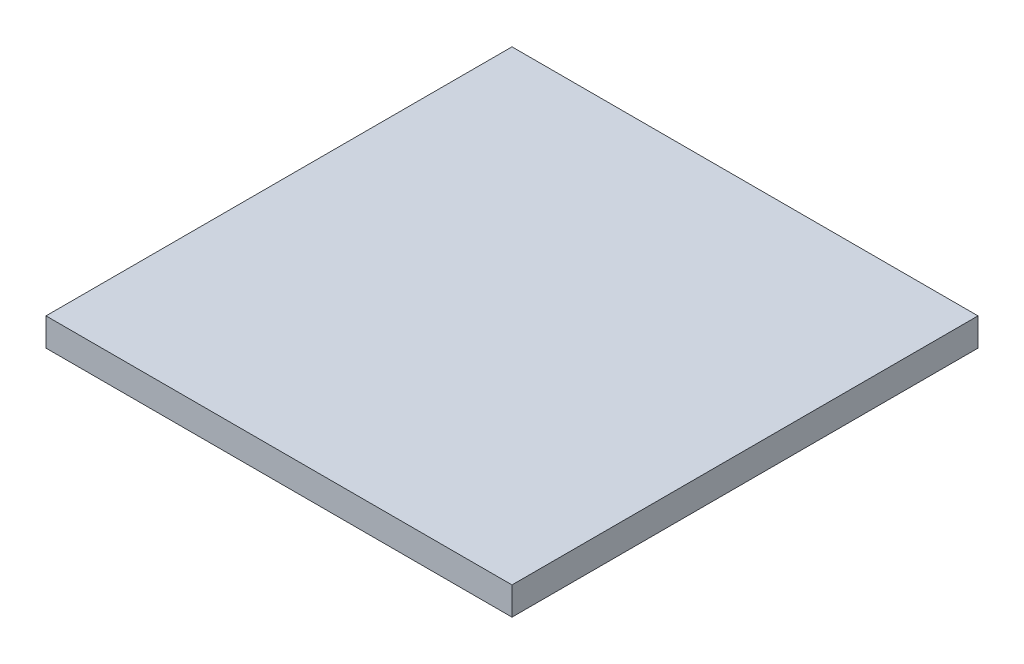
ISO-10303-21;
HEADER;
FILE_DESCRIPTION(('STEP AP214'),'2;1');
FILE_NAME('part.step','',(''),(''),'','','');
FILE_SCHEMA(('AUTOMOTIVE_DESIGN { 1 0 10303 214 1 1 1 1 }'));
ENDSEC;
DATA;
#1=APPLICATION_CONTEXT('core data for automotive mechanical design processes');
#2=APPLICATION_PROTOCOL_DEFINITION('international standard','automotive_design',2000,#1);
#3=PRODUCT_CONTEXT('',#1,'mechanical');
#4=PRODUCT('Part','Part','',(#3));
#5=PRODUCT_RELATED_PRODUCT_CATEGORY('part','',(#4));
#6=PRODUCT_DEFINITION_FORMATION('','',#4);
#7=PRODUCT_DEFINITION_CONTEXT('part definition',#1,'design');
#8=PRODUCT_DEFINITION('design','',#6,#7);
#9=PRODUCT_DEFINITION_SHAPE('','',#8);
#10=(LENGTH_UNIT() NAMED_UNIT(*) SI_UNIT(.MILLI.,.METRE.));
#11=(NAMED_UNIT(*) PLANE_ANGLE_UNIT() SI_UNIT($,.RADIAN.));
#12=(NAMED_UNIT(*) SI_UNIT($,.STERADIAN.) SOLID_ANGLE_UNIT());
#13=UNCERTAINTY_MEASURE_WITH_UNIT(LENGTH_MEASURE(1.E-05),#10,'distance_accuracy_value','');
#14=(GEOMETRIC_REPRESENTATION_CONTEXT(3) GLOBAL_UNCERTAINTY_ASSIGNED_CONTEXT((#13)) GLOBAL_UNIT_ASSIGNED_CONTEXT((#10,
#11,#12)) REPRESENTATION_CONTEXT('',''));
#15=CARTESIAN_POINT('',(0.,0.,0.));
#16=DIRECTION('',(0.,0.,1.));
#17=DIRECTION('',(1.,0.,0.));
#18=AXIS2_PLACEMENT_3D('',#15,#16,#17);
#19=CARTESIAN_POINT('',(0.,0.,500.));
#20=DIRECTION('',(1.,0.,0.));
#21=DIRECTION('',(0.,0.,-1.));
#22=AXIS2_PLACEMENT_3D('',#19,#20,#21);
#23=PLANE('',#22);
#24=DIRECTION('',(0.,-1.,0.));
#25=VECTOR('',#24,1.);
#26=CARTESIAN_POINT('',(0.,0.,0.));
#27=LINE('',#26,#25);
#28=CARTESIAN_POINT('',(0.,30.,0.));
#29=VERTEX_POINT('',#28);
#30=CARTESIAN_POINT('',(0.,0.,0.));
#31=VERTEX_POINT('',#30);
#32=EDGE_CURVE('E108',#29,#31,#27,.T.);
#33=ORIENTED_EDGE('',*,*,#32,.T.);
#34=DIRECTION('',(0.,0.,-1.));
#35=VECTOR('',#34,1.);
#36=CARTESIAN_POINT('',(0.,0.,500.));
#37=LINE('',#36,#35);
#38=CARTESIAN_POINT('',(0.,0.,500.));
#39=VERTEX_POINT('',#38);
#40=EDGE_CURVE('E11',#39,#31,#37,.T.);
#41=ORIENTED_EDGE('',*,*,#40,.F.);
#42=DIRECTION('',(0.,-1.,0.));
#43=VECTOR('',#42,1.);
#44=CARTESIAN_POINT('',(0.,0.,500.));
#45=LINE('',#44,#43);
#46=CARTESIAN_POINT('',(0.,30.,500.));
#47=VERTEX_POINT('',#46);
#48=EDGE_CURVE('E92',#47,#39,#45,.T.);
#49=ORIENTED_EDGE('',*,*,#48,.F.);
#50=DIRECTION('',(0.,0.,-1.));
#51=VECTOR('',#50,1.);
#52=CARTESIAN_POINT('',(0.,30.,500.));
#53=LINE('',#52,#51);
#54=EDGE_CURVE('E105',#47,#29,#53,.T.);
#55=ORIENTED_EDGE('',*,*,#54,.T.);
#56=EDGE_LOOP('',(#33,#41,#49,#55));
#57=FACE_BOUND('',#56,.T.);
#58=ADVANCED_FACE('F43',(#57),#23,.F.);
#59=CARTESIAN_POINT('',(0.,0.,500.));
#60=DIRECTION('',(0.,1.,0.));
#61=DIRECTION('',(0.,0.,1.));
#62=AXIS2_PLACEMENT_3D('',#59,#60,#61);
#63=PLANE('',#62);
#64=DIRECTION('',(1.,0.,0.));
#65=VECTOR('',#64,1.);
#66=CARTESIAN_POINT('',(0.,0.,0.));
#67=LINE('',#66,#65);
#68=CARTESIAN_POINT('',(500.,0.,0.));
#69=VERTEX_POINT('',#68);
#70=EDGE_CURVE('E97',#31,#69,#67,.T.);
#71=ORIENTED_EDGE('',*,*,#70,.T.);
#72=DIRECTION('',(0.,0.,-1.));
#73=VECTOR('',#72,1.);
#74=CARTESIAN_POINT('',(500.,0.,500.));
#75=LINE('',#74,#73);
#76=CARTESIAN_POINT('',(500.,0.,500.));
#77=VERTEX_POINT('',#76);
#78=EDGE_CURVE('E51',#77,#69,#75,.T.);
#79=ORIENTED_EDGE('',*,*,#78,.F.);
#80=DIRECTION('',(1.,0.,0.));
#81=VECTOR('',#80,1.);
#82=CARTESIAN_POINT('',(0.,0.,500.));
#83=LINE('',#82,#81);
#84=EDGE_CURVE('E87',#39,#77,#83,.T.);
#85=ORIENTED_EDGE('',*,*,#84,.F.);
#86=ORIENTED_EDGE('',*,*,#40,.T.);
#87=EDGE_LOOP('',(#71,#79,#85,#86));
#88=FACE_BOUND('',#87,.T.);
#89=ADVANCED_FACE('F100',(#88),#63,.F.);
#90=CARTESIAN_POINT('',(500.,0.,500.));
#91=DIRECTION('',(-1.,0.,0.));
#92=DIRECTION('',(0.,0.,1.));
#93=AXIS2_PLACEMENT_3D('',#90,#91,#92);
#94=PLANE('',#93);
#95=DIRECTION('',(0.,1.,0.));
#96=VECTOR('',#95,1.);
#97=CARTESIAN_POINT('',(500.,0.,0.));
#98=LINE('',#97,#96);
#99=CARTESIAN_POINT('',(500.,30.,0.));
#100=VERTEX_POINT('',#99);
#101=EDGE_CURVE('E78',#69,#100,#98,.T.);
#102=ORIENTED_EDGE('',*,*,#101,.T.);
#103=DIRECTION('',(0.,0.,-1.));
#104=VECTOR('',#103,1.);
#105=CARTESIAN_POINT('',(500.,30.,500.));
#106=LINE('',#105,#104);
#107=CARTESIAN_POINT('',(500.,30.,500.));
#108=VERTEX_POINT('',#107);
#109=EDGE_CURVE('E98',#108,#100,#106,.T.);
#110=ORIENTED_EDGE('',*,*,#109,.F.);
#111=DIRECTION('',(0.,1.,0.));
#112=VECTOR('',#111,1.);
#113=CARTESIAN_POINT('',(500.,0.,500.));
#114=LINE('',#113,#112);
#115=EDGE_CURVE('E95',#77,#108,#114,.T.);
#116=ORIENTED_EDGE('',*,*,#115,.F.);
#117=ORIENTED_EDGE('',*,*,#78,.T.);
#118=EDGE_LOOP('',(#102,#110,#116,#117));
#119=FACE_BOUND('',#118,.T.);
#120=ADVANCED_FACE('F99',(#119),#94,.F.);
#121=CARTESIAN_POINT('',(0.,30.,500.));
#122=DIRECTION('',(0.,-1.,0.));
#123=DIRECTION('',(0.,0.,-1.));
#124=AXIS2_PLACEMENT_3D('',#121,#122,#123);
#125=PLANE('',#124);
#126=DIRECTION('',(-1.,0.,0.));
#127=VECTOR('',#126,1.);
#128=CARTESIAN_POINT('',(0.,30.,0.));
#129=LINE('',#128,#127);
#130=EDGE_CURVE('E85',#100,#29,#129,.T.);
#131=ORIENTED_EDGE('',*,*,#130,.T.);
#132=ORIENTED_EDGE('',*,*,#54,.F.);
#133=DIRECTION('',(-1.,0.,0.));
#134=VECTOR('',#133,1.);
#135=CARTESIAN_POINT('',(0.,30.,500.));
#136=LINE('',#135,#134);
#137=EDGE_CURVE('E56',#108,#47,#136,.T.);
#138=ORIENTED_EDGE('',*,*,#137,.F.);
#139=ORIENTED_EDGE('',*,*,#109,.T.);
#140=EDGE_LOOP('',(#131,#132,#138,#139));
#141=FACE_BOUND('',#140,.T.);
#142=ADVANCED_FACE('F111',(#141),#125,.F.);
#143=CARTESIAN_POINT('',(0.,0.,500.));
#144=DIRECTION('',(0.,0.,-1.));
#145=DIRECTION('',(-1.,0.,0.));
#146=AXIS2_PLACEMENT_3D('',#143,#144,#145);
#147=PLANE('',#146);
#148=ORIENTED_EDGE('',*,*,#48,.T.);
#149=ORIENTED_EDGE('',*,*,#84,.T.);
#150=ORIENTED_EDGE('',*,*,#115,.T.);
#151=ORIENTED_EDGE('',*,*,#137,.T.);
#152=EDGE_LOOP('',(#148,#149,#150,#151));
#153=FACE_BOUND('',#152,.T.);
#154=ADVANCED_FACE('F89',(#153),#147,.F.);
#155=CARTESIAN_POINT('',(0.,0.,0.));
#156=DIRECTION('',(0.,0.,-1.));
#157=DIRECTION('',(-1.,0.,0.));
#158=AXIS2_PLACEMENT_3D('',#155,#156,#157);
#159=PLANE('',#158);
#160=ORIENTED_EDGE('',*,*,#32,.F.);
#161=ORIENTED_EDGE('',*,*,#130,.F.);
#162=ORIENTED_EDGE('',*,*,#101,.F.);
#163=ORIENTED_EDGE('',*,*,#70,.F.);
#164=EDGE_LOOP('',(#160,#161,#162,#163));
#165=FACE_BOUND('',#164,.T.);
#166=ADVANCED_FACE('F118',(#165),#159,.T.);
#167=CLOSED_SHELL('',(#58,#89,#120,#142,#154,#166));
#168=MANIFOLD_SOLID_BREP('B2',#167);
#169=ADVANCED_BREP_SHAPE_REPRESENTATION('',(#18,#168),#14);
#170=SHAPE_DEFINITION_REPRESENTATION(#9,#169);
ENDSEC;
END-ISO-10303-21;
